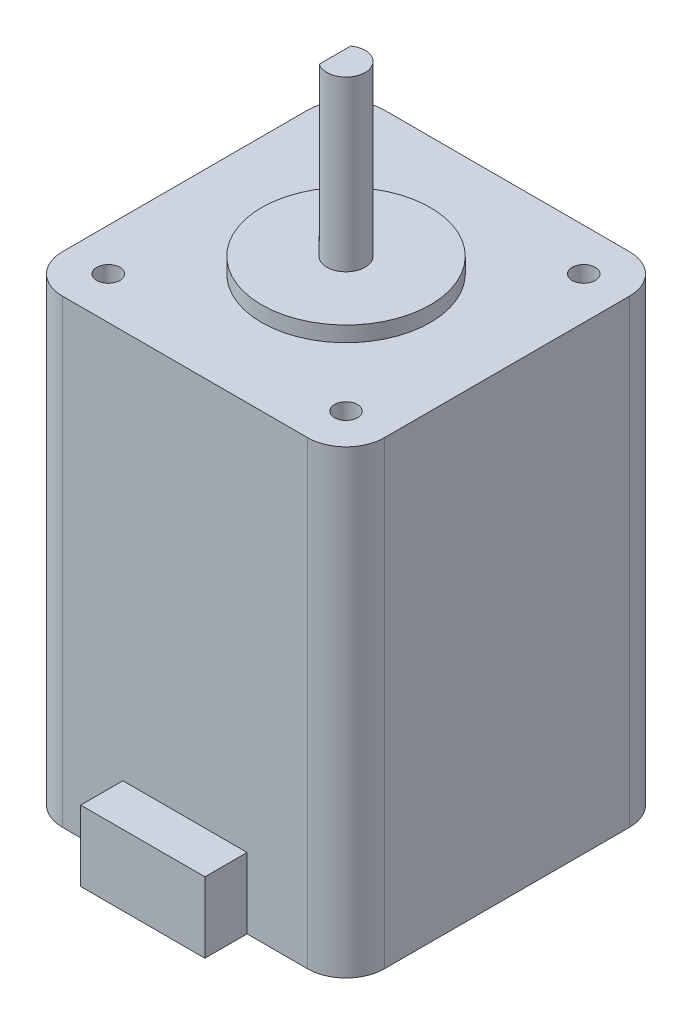
ISO-10303-21;
HEADER;
FILE_DESCRIPTION(('STEP AP214'),'2;1');
FILE_NAME('part.step','',(''),(''),'','','');
FILE_SCHEMA(('AUTOMOTIVE_DESIGN { 1 0 10303 214 1 1 1 1 }'));
ENDSEC;
DATA;
#1=APPLICATION_CONTEXT('core data for automotive mechanical design processes');
#2=APPLICATION_PROTOCOL_DEFINITION('international standard','automotive_design',2000,#1);
#3=PRODUCT_CONTEXT('',#1,'mechanical');
#4=PRODUCT('Part','Part','',(#3));
#5=PRODUCT_RELATED_PRODUCT_CATEGORY('part','',(#4));
#6=PRODUCT_DEFINITION_FORMATION('','',#4);
#7=PRODUCT_DEFINITION_CONTEXT('part definition',#1,'design');
#8=PRODUCT_DEFINITION('design','',#6,#7);
#9=PRODUCT_DEFINITION_SHAPE('','',#8);
#10=(LENGTH_UNIT() NAMED_UNIT(*) SI_UNIT(.MILLI.,.METRE.));
#11=(NAMED_UNIT(*) PLANE_ANGLE_UNIT() SI_UNIT($,.RADIAN.));
#12=(NAMED_UNIT(*) SI_UNIT($,.STERADIAN.) SOLID_ANGLE_UNIT());
#13=UNCERTAINTY_MEASURE_WITH_UNIT(LENGTH_MEASURE(1.E-05),#10,'distance_accuracy_value','');
#14=(GEOMETRIC_REPRESENTATION_CONTEXT(3) GLOBAL_UNCERTAINTY_ASSIGNED_CONTEXT((#13)) GLOBAL_UNIT_ASSIGNED_CONTEXT((#10,
#11,#12)) REPRESENTATION_CONTEXT('',''));
#15=CARTESIAN_POINT('',(0.,0.,0.));
#16=DIRECTION('',(0.,0.,1.));
#17=DIRECTION('',(1.,0.,0.));
#18=AXIS2_PLACEMENT_3D('',#15,#16,#17);
#19=CARTESIAN_POINT('',(0.,84.,0.));
#20=DIRECTION('',(0.,-1.,0.));
#21=DIRECTION('',(0.,0.,-1.));
#22=AXIS2_PLACEMENT_3D('',#19,#20,#21);
#23=CYLINDRICAL_SURFACE('',#22,2.5);
#24=CARTESIAN_POINT('',(0.,62.,0.));
#25=DIRECTION('',(0.,1.,0.));
#26=DIRECTION('',(0.,0.,1.));
#27=AXIS2_PLACEMENT_3D('',#24,#25,#26);
#28=CIRCLE('',#27,2.5);
#29=CARTESIAN_POINT('',(0.,62.,2.5));
#30=VERTEX_POINT('',#29);
#31=EDGE_CURVE('E250',#30,#30,#28,.T.);
#32=ORIENTED_EDGE('',*,*,#31,.T.);
#33=EDGE_LOOP('',(#32));
#34=FACE_BOUND('',#33,.T.);
#35=DIRECTION('',(0.,1.,0.));
#36=VECTOR('',#35,1.);
#37=CARTESIAN_POINT('',(-1.4382470003859,64.,-2.04485832415866));
#38=LINE('',#37,#36);
#39=CARTESIAN_POINT('',(-1.4382470003859,64.,-2.04485832415866));
#40=VERTEX_POINT('',#39);
#41=CARTESIAN_POINT('',(-1.4382470003859,84.,-2.04485832415866));
#42=VERTEX_POINT('',#41);
#43=EDGE_CURVE('E141',#40,#42,#38,.T.);
#44=ORIENTED_EDGE('',*,*,#43,.T.);
#45=CARTESIAN_POINT('',(0.,84.,0.));
#46=DIRECTION('',(0.,1.,0.));
#47=DIRECTION('',(0.,0.,1.));
#48=AXIS2_PLACEMENT_3D('',#45,#46,#47);
#49=CIRCLE('',#48,2.5);
#50=CARTESIAN_POINT('',(-1.4382470003859,84.,2.04485832415866));
#51=VERTEX_POINT('',#50);
#52=EDGE_CURVE('E246',#51,#42,#49,.T.);
#53=ORIENTED_EDGE('',*,*,#52,.F.);
#54=DIRECTION('',(0.,1.,0.));
#55=VECTOR('',#54,1.);
#56=CARTESIAN_POINT('',(-1.4382470003859,64.,2.04485832415866));
#57=LINE('',#56,#55);
#58=CARTESIAN_POINT('',(-1.4382470003859,64.,2.04485832415866));
#59=VERTEX_POINT('',#58);
#60=EDGE_CURVE('E57',#59,#51,#57,.T.);
#61=ORIENTED_EDGE('',*,*,#60,.F.);
#62=CARTESIAN_POINT('',(0.,64.,0.));
#63=DIRECTION('',(0.,1.,0.));
#64=DIRECTION('',(0.,0.,1.));
#65=AXIS2_PLACEMENT_3D('',#62,#63,#64);
#66=CIRCLE('',#65,2.5);
#67=EDGE_CURVE('E152',#40,#59,#66,.T.);
#68=ORIENTED_EDGE('',*,*,#67,.F.);
#69=EDGE_LOOP('',(#44,#53,#61,#68));
#70=FACE_BOUND('',#69,.T.);
#71=ADVANCED_FACE('F41',(#34,#70),#23,.T.);
#72=CARTESIAN_POINT('',(0.,84.,0.));
#73=DIRECTION('',(0.,1.,0.));
#74=DIRECTION('',(0.,0.,1.));
#75=AXIS2_PLACEMENT_3D('',#72,#73,#74);
#76=PLANE('',#75);
#77=ORIENTED_EDGE('',*,*,#52,.T.);
#78=DIRECTION('',(0.,0.,1.));
#79=VECTOR('',#78,1.);
#80=CARTESIAN_POINT('',(-1.4382470003859,84.,0.));
#81=LINE('',#80,#79);
#82=EDGE_CURVE('E146',#42,#51,#81,.T.);
#83=ORIENTED_EDGE('',*,*,#82,.T.);
#84=EDGE_LOOP('',(#77,#83));
#85=FACE_BOUND('',#84,.T.);
#86=ADVANCED_FACE('F399',(#85),#76,.T.);
#87=CARTESIAN_POINT('',(-21.,60.,21.));
#88=DIRECTION('',(0.,0.,-1.));
#89=DIRECTION('',(-1.,0.,0.));
#90=AXIS2_PLACEMENT_3D('',#87,#88,#89);
#91=PLANE('',#90);
#92=DIRECTION('',(1.,0.,0.));
#93=VECTOR('',#92,1.);
#94=CARTESIAN_POINT('',(-21.,0.,21.));
#95=LINE('',#94,#93);
#96=CARTESIAN_POINT('',(8.1,0.,21.));
#97=VERTEX_POINT('',#96);
#98=CARTESIAN_POINT('',(16.,0.,21.));
#99=VERTEX_POINT('',#98);
#100=EDGE_CURVE('E290',#97,#99,#95,.T.);
#101=ORIENTED_EDGE('',*,*,#100,.T.);
#102=DIRECTION('',(0.,-1.,0.));
#103=VECTOR('',#102,1.);
#104=CARTESIAN_POINT('',(16.,60.,21.));
#105=LINE('',#104,#103);
#106=CARTESIAN_POINT('',(16.,60.,21.));
#107=VERTEX_POINT('',#106);
#108=EDGE_CURVE('E11',#99,#107,#105,.F.);
#109=ORIENTED_EDGE('',*,*,#108,.T.);
#110=DIRECTION('',(1.,0.,0.));
#111=VECTOR('',#110,1.);
#112=CARTESIAN_POINT('',(-21.,60.,21.));
#113=LINE('',#112,#111);
#114=CARTESIAN_POINT('',(-16.,60.,21.));
#115=VERTEX_POINT('',#114);
#116=EDGE_CURVE('E263',#115,#107,#113,.T.);
#117=ORIENTED_EDGE('',*,*,#116,.F.);
#118=DIRECTION('',(0.,-1.,0.));
#119=VECTOR('',#118,1.);
#120=CARTESIAN_POINT('',(-16.,60.,21.));
#121=LINE('',#120,#119);
#122=CARTESIAN_POINT('',(-16.,0.,21.));
#123=VERTEX_POINT('',#122);
#124=EDGE_CURVE('E50',#115,#123,#121,.T.);
#125=ORIENTED_EDGE('',*,*,#124,.T.);
#126=CARTESIAN_POINT('',(-8.1,0.,21.));
#127=VERTEX_POINT('',#126);
#128=EDGE_CURVE('E269',#123,#127,#95,.T.);
#129=ORIENTED_EDGE('',*,*,#128,.T.);
#130=DIRECTION('',(0.,-1.,0.));
#131=VECTOR('',#130,1.);
#132=CARTESIAN_POINT('',(-8.1,9.2,21.));
#133=LINE('',#132,#131);
#134=CARTESIAN_POINT('',(-8.1,9.2,21.));
#135=VERTEX_POINT('',#134);
#136=EDGE_CURVE('E211',#135,#127,#133,.T.);
#137=ORIENTED_EDGE('',*,*,#136,.F.);
#138=DIRECTION('',(-1.,0.,0.));
#139=VECTOR('',#138,1.);
#140=CARTESIAN_POINT('',(-8.1,9.2,21.));
#141=LINE('',#140,#139);
#142=CARTESIAN_POINT('',(8.1,9.2,21.));
#143=VERTEX_POINT('',#142);
#144=EDGE_CURVE('E224',#143,#135,#141,.T.);
#145=ORIENTED_EDGE('',*,*,#144,.F.);
#146=DIRECTION('',(0.,1.,0.));
#147=VECTOR('',#146,1.);
#148=CARTESIAN_POINT('',(8.1,9.2,21.));
#149=LINE('',#148,#147);
#150=EDGE_CURVE('E202',#97,#143,#149,.T.);
#151=ORIENTED_EDGE('',*,*,#150,.F.);
#152=EDGE_LOOP('',(#101,#109,#117,#125,#129,#137,#145,#151));
#153=FACE_BOUND('',#152,.T.);
#154=ADVANCED_FACE('F340',(#153),#91,.F.);
#155=CARTESIAN_POINT('',(21.,60.,-21.));
#156=DIRECTION('',(-1.,0.,0.));
#157=DIRECTION('',(0.,0.,1.));
#158=AXIS2_PLACEMENT_3D('',#155,#156,#157);
#159=PLANE('',#158);
#160=DIRECTION('',(0.,0.,-1.));
#161=VECTOR('',#160,1.);
#162=CARTESIAN_POINT('',(21.,0.,-21.));
#163=LINE('',#162,#161);
#164=CARTESIAN_POINT('',(21.,0.,16.));
#165=VERTEX_POINT('',#164);
#166=CARTESIAN_POINT('',(21.,0.,-16.));
#167=VERTEX_POINT('',#166);
#168=EDGE_CURVE('E259',#165,#167,#163,.T.);
#169=ORIENTED_EDGE('',*,*,#168,.T.);
#170=DIRECTION('',(0.,-1.,0.));
#171=VECTOR('',#170,1.);
#172=CARTESIAN_POINT('',(21.,60.,-16.));
#173=LINE('',#172,#171);
#174=CARTESIAN_POINT('',(21.,60.,-16.));
#175=VERTEX_POINT('',#174);
#176=EDGE_CURVE('E315',#167,#175,#173,.F.);
#177=ORIENTED_EDGE('',*,*,#176,.T.);
#178=DIRECTION('',(0.,0.,-1.));
#179=VECTOR('',#178,1.);
#180=CARTESIAN_POINT('',(21.,60.,-21.));
#181=LINE('',#180,#179);
#182=CARTESIAN_POINT('',(21.,60.,16.));
#183=VERTEX_POINT('',#182);
#184=EDGE_CURVE('E264',#183,#175,#181,.T.);
#185=ORIENTED_EDGE('',*,*,#184,.F.);
#186=DIRECTION('',(0.,-1.,0.));
#187=VECTOR('',#186,1.);
#188=CARTESIAN_POINT('',(21.,60.,16.));
#189=LINE('',#188,#187);
#190=EDGE_CURVE('E311',#183,#165,#189,.T.);
#191=ORIENTED_EDGE('',*,*,#190,.T.);
#192=EDGE_LOOP('',(#169,#177,#185,#191));
#193=FACE_BOUND('',#192,.T.);
#194=ADVANCED_FACE('F369',(#193),#159,.F.);
#195=CARTESIAN_POINT('',(-21.,60.,-21.));
#196=DIRECTION('',(0.,0.,1.));
#197=DIRECTION('',(1.,0.,0.));
#198=AXIS2_PLACEMENT_3D('',#195,#196,#197);
#199=PLANE('',#198);
#200=DIRECTION('',(-1.,0.,0.));
#201=VECTOR('',#200,1.);
#202=CARTESIAN_POINT('',(-21.,60.,-21.));
#203=LINE('',#202,#201);
#204=CARTESIAN_POINT('',(16.,60.,-21.));
#205=VERTEX_POINT('',#204);
#206=CARTESIAN_POINT('',(-16.,60.,-21.));
#207=VERTEX_POINT('',#206);
#208=EDGE_CURVE('E268',#205,#207,#203,.T.);
#209=ORIENTED_EDGE('',*,*,#208,.F.);
#210=DIRECTION('',(0.,-1.,0.));
#211=VECTOR('',#210,1.);
#212=CARTESIAN_POINT('',(16.,60.,-21.));
#213=LINE('',#212,#211);
#214=CARTESIAN_POINT('',(16.,0.,-21.));
#215=VERTEX_POINT('',#214);
#216=EDGE_CURVE('E295',#205,#215,#213,.T.);
#217=ORIENTED_EDGE('',*,*,#216,.T.);
#218=DIRECTION('',(-1.,0.,0.));
#219=VECTOR('',#218,1.);
#220=CARTESIAN_POINT('',(-21.,0.,-21.));
#221=LINE('',#220,#219);
#222=CARTESIAN_POINT('',(-16.,0.,-21.));
#223=VERTEX_POINT('',#222);
#224=EDGE_CURVE('E282',#215,#223,#221,.T.);
#225=ORIENTED_EDGE('',*,*,#224,.T.);
#226=DIRECTION('',(0.,-1.,0.));
#227=VECTOR('',#226,1.);
#228=CARTESIAN_POINT('',(-16.,60.,-21.));
#229=LINE('',#228,#227);
#230=EDGE_CURVE('E254',#223,#207,#229,.F.);
#231=ORIENTED_EDGE('',*,*,#230,.T.);
#232=EDGE_LOOP('',(#209,#217,#225,#231));
#233=FACE_BOUND('',#232,.T.);
#234=ADVANCED_FACE('F379',(#233),#199,.F.);
#235=CARTESIAN_POINT('',(-21.,60.,-21.));
#236=DIRECTION('',(1.,0.,0.));
#237=DIRECTION('',(0.,0.,-1.));
#238=AXIS2_PLACEMENT_3D('',#235,#236,#237);
#239=PLANE('',#238);
#240=DIRECTION('',(0.,0.,1.));
#241=VECTOR('',#240,1.);
#242=CARTESIAN_POINT('',(-21.,60.,-21.));
#243=LINE('',#242,#241);
#244=CARTESIAN_POINT('',(-21.,60.,-16.));
#245=VERTEX_POINT('',#244);
#246=CARTESIAN_POINT('',(-21.,60.,16.));
#247=VERTEX_POINT('',#246);
#248=EDGE_CURVE('E273',#245,#247,#243,.T.);
#249=ORIENTED_EDGE('',*,*,#248,.F.);
#250=DIRECTION('',(0.,-1.,0.));
#251=VECTOR('',#250,1.);
#252=CARTESIAN_POINT('',(-21.,60.,-16.));
#253=LINE('',#252,#251);
#254=CARTESIAN_POINT('',(-21.,0.,-16.));
#255=VERTEX_POINT('',#254);
#256=EDGE_CURVE('E333',#245,#255,#253,.T.);
#257=ORIENTED_EDGE('',*,*,#256,.T.);
#258=DIRECTION('',(0.,0.,1.));
#259=VECTOR('',#258,1.);
#260=CARTESIAN_POINT('',(-21.,0.,-21.));
#261=LINE('',#260,#259);
#262=CARTESIAN_POINT('',(-21.,0.,16.));
#263=VERTEX_POINT('',#262);
#264=EDGE_CURVE('E286',#255,#263,#261,.T.);
#265=ORIENTED_EDGE('',*,*,#264,.T.);
#266=DIRECTION('',(0.,-1.,0.));
#267=VECTOR('',#266,1.);
#268=CARTESIAN_POINT('',(-21.,60.,16.));
#269=LINE('',#268,#267);
#270=EDGE_CURVE('E330',#263,#247,#269,.F.);
#271=ORIENTED_EDGE('',*,*,#270,.T.);
#272=EDGE_LOOP('',(#249,#257,#265,#271));
#273=FACE_BOUND('',#272,.T.);
#274=ADVANCED_FACE('F387',(#273),#239,.F.);
#275=CARTESIAN_POINT('',(0.,60.,0.));
#276=DIRECTION('',(0.,1.,0.));
#277=DIRECTION('',(0.,0.,1.));
#278=AXIS2_PLACEMENT_3D('',#275,#276,#277);
#279=PLANE('',#278);
#280=CARTESIAN_POINT('',(-15.4999999999991,60.,15.5));
#281=DIRECTION('',(0.,1.,0.));
#282=DIRECTION('',(0.,0.,1.));
#283=AXIS2_PLACEMENT_3D('',#280,#281,#282);
#284=CIRCLE('',#283,1.50000000000046);
#285=CARTESIAN_POINT('',(-15.4999999999991,60.,17.0000000000005));
#286=VERTEX_POINT('',#285);
#287=EDGE_CURVE('E170',#286,#286,#284,.T.);
#288=ORIENTED_EDGE('',*,*,#287,.F.);
#289=EDGE_LOOP('',(#288));
#290=FACE_BOUND('',#289,.T.);
#291=CARTESIAN_POINT('',(15.5000000000009,60.,15.4999999999991));
#292=DIRECTION('',(0.,1.,0.));
#293=DIRECTION('',(0.,0.,1.));
#294=AXIS2_PLACEMENT_3D('',#291,#292,#293);
#295=CIRCLE('',#294,1.50000000000121);
#296=CARTESIAN_POINT('',(15.5000000000009,60.,17.0000000000003));
#297=VERTEX_POINT('',#296);
#298=EDGE_CURVE('E187',#297,#297,#295,.T.);
#299=ORIENTED_EDGE('',*,*,#298,.F.);
#300=EDGE_LOOP('',(#299));
#301=FACE_BOUND('',#300,.T.);
#302=CARTESIAN_POINT('',(15.5,60.,-15.5000000000009));
#303=DIRECTION('',(0.,1.,0.));
#304=DIRECTION('',(0.,0.,1.));
#305=AXIS2_PLACEMENT_3D('',#302,#303,#304);
#306=CIRCLE('',#305,1.5000000000009);
#307=CARTESIAN_POINT('',(15.5,60.,-14.));
#308=VERTEX_POINT('',#307);
#309=EDGE_CURVE('E179',#308,#308,#306,.T.);
#310=ORIENTED_EDGE('',*,*,#309,.F.);
#311=EDGE_LOOP('',(#310));
#312=FACE_BOUND('',#311,.T.);
#313=CARTESIAN_POINT('',(-15.5,60.,-15.5));
#314=DIRECTION('',(0.,1.,0.));
#315=DIRECTION('',(0.,0.,1.));
#316=AXIS2_PLACEMENT_3D('',#313,#314,#315);
#317=CIRCLE('',#316,1.5);
#318=CARTESIAN_POINT('',(-15.5,60.,-14.));
#319=VERTEX_POINT('',#318);
#320=EDGE_CURVE('E178',#319,#319,#317,.T.);
#321=ORIENTED_EDGE('',*,*,#320,.F.);
#322=EDGE_LOOP('',(#321));
#323=FACE_BOUND('',#322,.T.);
#324=CARTESIAN_POINT('',(0.,60.,0.));
#325=DIRECTION('',(0.,1.,0.));
#326=DIRECTION('',(0.,0.,1.));
#327=AXIS2_PLACEMENT_3D('',#324,#325,#326);
#328=CIRCLE('',#327,11.);
#329=CARTESIAN_POINT('',(0.,60.,11.));
#330=VERTEX_POINT('',#329);
#331=EDGE_CURVE('E255',#330,#330,#328,.T.);
#332=ORIENTED_EDGE('',*,*,#331,.F.);
#333=EDGE_LOOP('',(#332));
#334=FACE_BOUND('',#333,.T.);
#335=ORIENTED_EDGE('',*,*,#184,.T.);
#336=CARTESIAN_POINT('',(16.,60.,-16.));
#337=DIRECTION('',(0.,1.,0.));
#338=DIRECTION('',(0.,0.,1.));
#339=AXIS2_PLACEMENT_3D('',#336,#337,#338);
#340=CIRCLE('',#339,5.);
#341=EDGE_CURVE('E327',#175,#205,#340,.T.);
#342=ORIENTED_EDGE('',*,*,#341,.T.);
#343=ORIENTED_EDGE('',*,*,#208,.T.);
#344=CARTESIAN_POINT('',(-16.,60.,-16.));
#345=DIRECTION('',(0.,1.,0.));
#346=DIRECTION('',(0.,0.,1.));
#347=AXIS2_PLACEMENT_3D('',#344,#345,#346);
#348=CIRCLE('',#347,5.);
#349=EDGE_CURVE('E324',#207,#245,#348,.T.);
#350=ORIENTED_EDGE('',*,*,#349,.T.);
#351=ORIENTED_EDGE('',*,*,#248,.T.);
#352=CARTESIAN_POINT('',(-16.,60.,16.));
#353=DIRECTION('',(0.,1.,0.));
#354=DIRECTION('',(0.,0.,1.));
#355=AXIS2_PLACEMENT_3D('',#352,#353,#354);
#356=CIRCLE('',#355,5.);
#357=EDGE_CURVE('E318',#247,#115,#356,.T.);
#358=ORIENTED_EDGE('',*,*,#357,.T.);
#359=ORIENTED_EDGE('',*,*,#116,.T.);
#360=CARTESIAN_POINT('',(16.,60.,16.));
#361=DIRECTION('',(0.,1.,0.));
#362=DIRECTION('',(0.,0.,1.));
#363=AXIS2_PLACEMENT_3D('',#360,#361,#362);
#364=CIRCLE('',#363,5.);
#365=EDGE_CURVE('E321',#107,#183,#364,.T.);
#366=ORIENTED_EDGE('',*,*,#365,.T.);
#367=EDGE_LOOP('',(#335,#342,#343,#350,#351,#358,#359,#366));
#368=FACE_BOUND('',#367,.T.);
#369=ADVANCED_FACE('F373',(#290,#301,#312,#323,#334,#368),#279,.T.);
#370=CARTESIAN_POINT('',(0.,0.,0.));
#371=DIRECTION('',(0.,1.,0.));
#372=DIRECTION('',(0.,0.,1.));
#373=AXIS2_PLACEMENT_3D('',#370,#371,#372);
#374=PLANE('',#373);
#375=CARTESIAN_POINT('',(0.,0.,0.));
#376=DIRECTION('',(0.,-1.,0.));
#377=DIRECTION('',(0.,0.,-1.));
#378=AXIS2_PLACEMENT_3D('',#375,#376,#377);
#379=CIRCLE('',#378,4.);
#380=CARTESIAN_POINT('',(0.,0.,-4.));
#381=VERTEX_POINT('',#380);
#382=EDGE_CURVE('E164',#381,#381,#379,.T.);
#383=ORIENTED_EDGE('',*,*,#382,.F.);
#384=EDGE_LOOP('',(#383));
#385=FACE_BOUND('',#384,.T.);
#386=ORIENTED_EDGE('',*,*,#224,.F.);
#387=CARTESIAN_POINT('',(16.,0.,-16.));
#388=DIRECTION('',(0.,1.,0.));
#389=DIRECTION('',(0.,0.,1.));
#390=AXIS2_PLACEMENT_3D('',#387,#388,#389);
#391=CIRCLE('',#390,5.);
#392=EDGE_CURVE('E308',#215,#167,#391,.F.);
#393=ORIENTED_EDGE('',*,*,#392,.T.);
#394=ORIENTED_EDGE('',*,*,#168,.F.);
#395=CARTESIAN_POINT('',(16.,0.,16.));
#396=DIRECTION('',(0.,1.,0.));
#397=DIRECTION('',(0.,0.,1.));
#398=AXIS2_PLACEMENT_3D('',#395,#396,#397);
#399=CIRCLE('',#398,5.);
#400=EDGE_CURVE('E302',#165,#99,#399,.F.);
#401=ORIENTED_EDGE('',*,*,#400,.T.);
#402=ORIENTED_EDGE('',*,*,#100,.F.);
#403=DIRECTION('',(0.,0.,-1.));
#404=VECTOR('',#403,1.);
#405=CARTESIAN_POINT('',(8.1,0.,26.5));
#406=LINE('',#405,#404);
#407=CARTESIAN_POINT('',(8.1,0.,26.5));
#408=VERTEX_POINT('',#407);
#409=EDGE_CURVE('E220',#408,#97,#406,.T.);
#410=ORIENTED_EDGE('',*,*,#409,.F.);
#411=DIRECTION('',(1.,0.,0.));
#412=VECTOR('',#411,1.);
#413=CARTESIAN_POINT('',(-8.1,0.,26.5));
#414=LINE('',#413,#412);
#415=CARTESIAN_POINT('',(-8.1,0.,26.5));
#416=VERTEX_POINT('',#415);
#417=EDGE_CURVE('E217',#416,#408,#414,.T.);
#418=ORIENTED_EDGE('',*,*,#417,.F.);
#419=DIRECTION('',(0.,0.,-1.));
#420=VECTOR('',#419,1.);
#421=CARTESIAN_POINT('',(-8.1,0.,26.5));
#422=LINE('',#421,#420);
#423=EDGE_CURVE('E234',#416,#127,#422,.T.);
#424=ORIENTED_EDGE('',*,*,#423,.T.);
#425=ORIENTED_EDGE('',*,*,#128,.F.);
#426=CARTESIAN_POINT('',(-16.,0.,16.));
#427=DIRECTION('',(0.,1.,0.));
#428=DIRECTION('',(0.,0.,1.));
#429=AXIS2_PLACEMENT_3D('',#426,#427,#428);
#430=CIRCLE('',#429,5.);
#431=EDGE_CURVE('E299',#123,#263,#430,.F.);
#432=ORIENTED_EDGE('',*,*,#431,.T.);
#433=ORIENTED_EDGE('',*,*,#264,.F.);
#434=CARTESIAN_POINT('',(-16.,0.,-16.));
#435=DIRECTION('',(0.,1.,0.));
#436=DIRECTION('',(0.,0.,1.));
#437=AXIS2_PLACEMENT_3D('',#434,#435,#436);
#438=CIRCLE('',#437,5.);
#439=EDGE_CURVE('E305',#255,#223,#438,.F.);
#440=ORIENTED_EDGE('',*,*,#439,.T.);
#441=EDGE_LOOP('',(#386,#393,#394,#401,#402,#410,#418,#424,#425,#432,#433,#440));
#442=FACE_BOUND('',#441,.T.);
#443=ADVANCED_FACE('F345',(#385,#442),#374,.F.);
#444=CARTESIAN_POINT('',(0.,62.,0.));
#445=DIRECTION('',(0.,-1.,0.));
#446=DIRECTION('',(0.,0.,-1.));
#447=AXIS2_PLACEMENT_3D('',#444,#445,#446);
#448=CYLINDRICAL_SURFACE('',#447,11.);
#449=CARTESIAN_POINT('',(0.,62.,0.));
#450=DIRECTION('',(0.,1.,0.));
#451=DIRECTION('',(0.,0.,1.));
#452=AXIS2_PLACEMENT_3D('',#449,#450,#451);
#453=CIRCLE('',#452,11.);
#454=CARTESIAN_POINT('',(0.,62.,11.));
#455=VERTEX_POINT('',#454);
#456=EDGE_CURVE('E249',#455,#455,#453,.T.);
#457=ORIENTED_EDGE('',*,*,#456,.F.);
#458=EDGE_LOOP('',(#457));
#459=FACE_BOUND('',#458,.T.);
#460=ORIENTED_EDGE('',*,*,#331,.T.);
#461=EDGE_LOOP('',(#460));
#462=FACE_BOUND('',#461,.T.);
#463=ADVANCED_FACE('F412',(#459,#462),#448,.T.);
#464=CARTESIAN_POINT('',(0.,62.,0.));
#465=DIRECTION('',(0.,1.,0.));
#466=DIRECTION('',(0.,0.,1.));
#467=AXIS2_PLACEMENT_3D('',#464,#465,#466);
#468=PLANE('',#467);
#469=ORIENTED_EDGE('',*,*,#31,.F.);
#470=EDGE_LOOP('',(#469));
#471=FACE_BOUND('',#470,.T.);
#472=ORIENTED_EDGE('',*,*,#456,.T.);
#473=EDGE_LOOP('',(#472));
#474=FACE_BOUND('',#473,.T.);
#475=ADVANCED_FACE('F409',(#471,#474),#468,.T.);
#476=CARTESIAN_POINT('',(8.1,9.2,26.5));
#477=DIRECTION('',(-1.,0.,0.));
#478=DIRECTION('',(0.,0.,1.));
#479=AXIS2_PLACEMENT_3D('',#476,#477,#478);
#480=PLANE('',#479);
#481=ORIENTED_EDGE('',*,*,#150,.T.);
#482=DIRECTION('',(0.,0.,-1.));
#483=VECTOR('',#482,1.);
#484=CARTESIAN_POINT('',(8.1,9.2,26.5));
#485=LINE('',#484,#483);
#486=CARTESIAN_POINT('',(8.1,9.2,26.5));
#487=VERTEX_POINT('',#486);
#488=EDGE_CURVE('E242',#487,#143,#485,.T.);
#489=ORIENTED_EDGE('',*,*,#488,.F.);
#490=DIRECTION('',(0.,1.,0.));
#491=VECTOR('',#490,1.);
#492=CARTESIAN_POINT('',(8.1,9.2,26.5));
#493=LINE('',#492,#491);
#494=EDGE_CURVE('E206',#408,#487,#493,.T.);
#495=ORIENTED_EDGE('',*,*,#494,.F.);
#496=ORIENTED_EDGE('',*,*,#409,.T.);
#497=EDGE_LOOP('',(#481,#489,#495,#496));
#498=FACE_BOUND('',#497,.T.);
#499=ADVANCED_FACE('F359',(#498),#480,.F.);
#500=CARTESIAN_POINT('',(-8.1,9.2,26.5));
#501=DIRECTION('',(0.,-1.,0.));
#502=DIRECTION('',(0.,0.,-1.));
#503=AXIS2_PLACEMENT_3D('',#500,#501,#502);
#504=PLANE('',#503);
#505=ORIENTED_EDGE('',*,*,#144,.T.);
#506=DIRECTION('',(0.,0.,-1.));
#507=VECTOR('',#506,1.);
#508=CARTESIAN_POINT('',(-8.1,9.2,26.5));
#509=LINE('',#508,#507);
#510=CARTESIAN_POINT('',(-8.1,9.2,26.5));
#511=VERTEX_POINT('',#510);
#512=EDGE_CURVE('E238',#511,#135,#509,.T.);
#513=ORIENTED_EDGE('',*,*,#512,.F.);
#514=DIRECTION('',(-1.,0.,0.));
#515=VECTOR('',#514,1.);
#516=CARTESIAN_POINT('',(-8.1,9.2,26.5));
#517=LINE('',#516,#515);
#518=EDGE_CURVE('E210',#487,#511,#517,.T.);
#519=ORIENTED_EDGE('',*,*,#518,.F.);
#520=ORIENTED_EDGE('',*,*,#488,.T.);
#521=EDGE_LOOP('',(#505,#513,#519,#520));
#522=FACE_BOUND('',#521,.T.);
#523=ADVANCED_FACE('F355',(#522),#504,.F.);
#524=CARTESIAN_POINT('',(-8.1,9.2,26.5));
#525=DIRECTION('',(1.,0.,0.));
#526=DIRECTION('',(0.,1.,0.));
#527=AXIS2_PLACEMENT_3D('',#524,#525,#526);
#528=PLANE('',#527);
#529=ORIENTED_EDGE('',*,*,#136,.T.);
#530=ORIENTED_EDGE('',*,*,#423,.F.);
#531=DIRECTION('',(0.,-1.,0.));
#532=VECTOR('',#531,1.);
#533=CARTESIAN_POINT('',(-8.1,9.2,26.5));
#534=LINE('',#533,#532);
#535=EDGE_CURVE('E214',#511,#416,#534,.T.);
#536=ORIENTED_EDGE('',*,*,#535,.F.);
#537=ORIENTED_EDGE('',*,*,#512,.T.);
#538=EDGE_LOOP('',(#529,#530,#536,#537));
#539=FACE_BOUND('',#538,.T.);
#540=ADVANCED_FACE('F352',(#539),#528,.F.);
#541=CARTESIAN_POINT('',(0.,0.,26.5));
#542=DIRECTION('',(0.,0.,1.));
#543=DIRECTION('',(1.,0.,0.));
#544=AXIS2_PLACEMENT_3D('',#541,#542,#543);
#545=PLANE('',#544);
#546=ORIENTED_EDGE('',*,*,#494,.T.);
#547=ORIENTED_EDGE('',*,*,#518,.T.);
#548=ORIENTED_EDGE('',*,*,#535,.T.);
#549=ORIENTED_EDGE('',*,*,#417,.T.);
#550=EDGE_LOOP('',(#546,#547,#548,#549));
#551=FACE_BOUND('',#550,.T.);
#552=ADVANCED_FACE('F482',(#551),#545,.T.);
#553=CARTESIAN_POINT('',(-15.5,55.,-15.5));
#554=DIRECTION('',(0.,1.,0.));
#555=DIRECTION('',(0.,0.,1.));
#556=AXIS2_PLACEMENT_3D('',#553,#554,#555);
#557=CYLINDRICAL_SURFACE('',#556,1.5);
#558=CARTESIAN_POINT('',(-15.5,55.,-15.5));
#559=DIRECTION('',(0.,1.,0.));
#560=DIRECTION('',(0.,0.,1.));
#561=AXIS2_PLACEMENT_3D('',#558,#559,#560);
#562=CIRCLE('',#561,1.5);
#563=CARTESIAN_POINT('',(-15.5,55.,-14.));
#564=VERTEX_POINT('',#563);
#565=EDGE_CURVE('E198',#564,#564,#562,.T.);
#566=ORIENTED_EDGE('',*,*,#565,.F.);
#567=EDGE_LOOP('',(#566));
#568=FACE_BOUND('',#567,.T.);
#569=ORIENTED_EDGE('',*,*,#320,.T.);
#570=EDGE_LOOP('',(#569));
#571=FACE_BOUND('',#570,.T.);
#572=ADVANCED_FACE('F489',(#568,#571),#557,.F.);
#573=CARTESIAN_POINT('',(-15.5,55.,-15.5));
#574=DIRECTION('',(0.,1.,0.));
#575=DIRECTION('',(0.,0.,1.));
#576=AXIS2_PLACEMENT_3D('',#573,#574,#575);
#577=PLANE('',#576);
#578=ORIENTED_EDGE('',*,*,#565,.T.);
#579=EDGE_LOOP('',(#578));
#580=FACE_BOUND('',#579,.T.);
#581=ADVANCED_FACE('F497',(#580),#577,.T.);
#582=CARTESIAN_POINT('',(15.5,55.,-15.5000000000009));
#583=DIRECTION('',(0.,1.,0.));
#584=DIRECTION('',(0.,0.,1.));
#585=AXIS2_PLACEMENT_3D('',#582,#583,#584);
#586=CYLINDRICAL_SURFACE('',#585,1.5000000000009);
#587=CARTESIAN_POINT('',(15.5,55.,-15.5000000000009));
#588=DIRECTION('',(0.,1.,0.));
#589=DIRECTION('',(0.,0.,1.));
#590=AXIS2_PLACEMENT_3D('',#587,#588,#589);
#591=CIRCLE('',#590,1.5000000000009);
#592=CARTESIAN_POINT('',(15.5,55.,-14.));
#593=VERTEX_POINT('',#592);
#594=EDGE_CURVE('E174',#593,#593,#591,.T.);
#595=ORIENTED_EDGE('',*,*,#594,.F.);
#596=EDGE_LOOP('',(#595));
#597=FACE_BOUND('',#596,.T.);
#598=ORIENTED_EDGE('',*,*,#309,.T.);
#599=EDGE_LOOP('',(#598));
#600=FACE_BOUND('',#599,.T.);
#601=ADVANCED_FACE('F505',(#597,#600),#586,.F.);
#602=CARTESIAN_POINT('',(15.5,55.,-15.5000000000009));
#603=DIRECTION('',(0.,1.,0.));
#604=DIRECTION('',(0.,0.,1.));
#605=AXIS2_PLACEMENT_3D('',#602,#603,#604);
#606=PLANE('',#605);
#607=ORIENTED_EDGE('',*,*,#594,.T.);
#608=EDGE_LOOP('',(#607));
#609=FACE_BOUND('',#608,.T.);
#610=ADVANCED_FACE('F513',(#609),#606,.T.);
#611=CARTESIAN_POINT('',(15.5000000000009,55.,15.4999999999991));
#612=DIRECTION('',(0.,1.,0.));
#613=DIRECTION('',(0.,0.,1.));
#614=AXIS2_PLACEMENT_3D('',#611,#612,#613);
#615=CYLINDRICAL_SURFACE('',#614,1.50000000000121);
#616=CARTESIAN_POINT('',(15.5000000000009,55.,15.4999999999991));
#617=DIRECTION('',(0.,1.,0.));
#618=DIRECTION('',(0.,0.,1.));
#619=AXIS2_PLACEMENT_3D('',#616,#617,#618);
#620=CIRCLE('',#619,1.50000000000121);
#621=CARTESIAN_POINT('',(15.5000000000009,55.,17.0000000000003));
#622=VERTEX_POINT('',#621);
#623=EDGE_CURVE('E183',#622,#622,#620,.T.);
#624=ORIENTED_EDGE('',*,*,#623,.F.);
#625=EDGE_LOOP('',(#624));
#626=FACE_BOUND('',#625,.T.);
#627=ORIENTED_EDGE('',*,*,#298,.T.);
#628=EDGE_LOOP('',(#627));
#629=FACE_BOUND('',#628,.T.);
#630=ADVANCED_FACE('F521',(#626,#629),#615,.F.);
#631=CARTESIAN_POINT('',(15.5000000000009,55.,15.4999999999991));
#632=DIRECTION('',(0.,1.,0.));
#633=DIRECTION('',(0.,0.,1.));
#634=AXIS2_PLACEMENT_3D('',#631,#632,#633);
#635=PLANE('',#634);
#636=ORIENTED_EDGE('',*,*,#623,.T.);
#637=EDGE_LOOP('',(#636));
#638=FACE_BOUND('',#637,.T.);
#639=ADVANCED_FACE('F529',(#638),#635,.T.);
#640=CARTESIAN_POINT('',(-15.4999999999991,55.,15.5));
#641=DIRECTION('',(0.,1.,0.));
#642=DIRECTION('',(0.,0.,1.));
#643=AXIS2_PLACEMENT_3D('',#640,#641,#642);
#644=CYLINDRICAL_SURFACE('',#643,1.50000000000046);
#645=CARTESIAN_POINT('',(-15.4999999999991,55.,15.5));
#646=DIRECTION('',(0.,1.,0.));
#647=DIRECTION('',(0.,0.,1.));
#648=AXIS2_PLACEMENT_3D('',#645,#646,#647);
#649=CIRCLE('',#648,1.50000000000046);
#650=CARTESIAN_POINT('',(-15.4999999999991,55.,17.0000000000005));
#651=VERTEX_POINT('',#650);
#652=EDGE_CURVE('E191',#651,#651,#649,.T.);
#653=ORIENTED_EDGE('',*,*,#652,.F.);
#654=EDGE_LOOP('',(#653));
#655=FACE_BOUND('',#654,.T.);
#656=ORIENTED_EDGE('',*,*,#287,.T.);
#657=EDGE_LOOP('',(#656));
#658=FACE_BOUND('',#657,.T.);
#659=ADVANCED_FACE('F537',(#655,#658),#644,.F.);
#660=CARTESIAN_POINT('',(-15.4999999999991,55.,15.5));
#661=DIRECTION('',(0.,1.,0.));
#662=DIRECTION('',(0.,0.,1.));
#663=AXIS2_PLACEMENT_3D('',#660,#661,#662);
#664=PLANE('',#663);
#665=ORIENTED_EDGE('',*,*,#652,.T.);
#666=EDGE_LOOP('',(#665));
#667=FACE_BOUND('',#666,.T.);
#668=ADVANCED_FACE('F433',(#667),#664,.T.);
#669=CARTESIAN_POINT('',(16.,60.,-16.));
#670=DIRECTION('',(0.,-1.,0.));
#671=DIRECTION('',(0.,0.,-1.));
#672=AXIS2_PLACEMENT_3D('',#669,#670,#671);
#673=CYLINDRICAL_SURFACE('',#672,5.);
#674=ORIENTED_EDGE('',*,*,#341,.F.);
#675=ORIENTED_EDGE('',*,*,#176,.F.);
#676=ORIENTED_EDGE('',*,*,#392,.F.);
#677=ORIENTED_EDGE('',*,*,#216,.F.);
#678=EDGE_LOOP('',(#674,#675,#676,#677));
#679=FACE_BOUND('',#678,.T.);
#680=ADVANCED_FACE('F377',(#679),#673,.T.);
#681=CARTESIAN_POINT('',(-16.,60.,-16.));
#682=DIRECTION('',(0.,-1.,0.));
#683=DIRECTION('',(0.,0.,-1.));
#684=AXIS2_PLACEMENT_3D('',#681,#682,#683);
#685=CYLINDRICAL_SURFACE('',#684,5.);
#686=ORIENTED_EDGE('',*,*,#349,.F.);
#687=ORIENTED_EDGE('',*,*,#230,.F.);
#688=ORIENTED_EDGE('',*,*,#439,.F.);
#689=ORIENTED_EDGE('',*,*,#256,.F.);
#690=EDGE_LOOP('',(#686,#687,#688,#689));
#691=FACE_BOUND('',#690,.T.);
#692=ADVANCED_FACE('F384',(#691),#685,.T.);
#693=CARTESIAN_POINT('',(16.,60.,16.));
#694=DIRECTION('',(0.,-1.,0.));
#695=DIRECTION('',(0.,0.,-1.));
#696=AXIS2_PLACEMENT_3D('',#693,#694,#695);
#697=CYLINDRICAL_SURFACE('',#696,5.);
#698=ORIENTED_EDGE('',*,*,#365,.F.);
#699=ORIENTED_EDGE('',*,*,#108,.F.);
#700=ORIENTED_EDGE('',*,*,#400,.F.);
#701=ORIENTED_EDGE('',*,*,#190,.F.);
#702=EDGE_LOOP('',(#698,#699,#700,#701));
#703=FACE_BOUND('',#702,.T.);
#704=ADVANCED_FACE('F366',(#703),#697,.T.);
#705=CARTESIAN_POINT('',(-16.,60.,16.));
#706=DIRECTION('',(0.,-1.,0.));
#707=DIRECTION('',(0.,0.,-1.));
#708=AXIS2_PLACEMENT_3D('',#705,#706,#707);
#709=CYLINDRICAL_SURFACE('',#708,5.);
#710=ORIENTED_EDGE('',*,*,#357,.F.);
#711=ORIENTED_EDGE('',*,*,#270,.F.);
#712=ORIENTED_EDGE('',*,*,#431,.F.);
#713=ORIENTED_EDGE('',*,*,#124,.F.);
#714=EDGE_LOOP('',(#710,#711,#712,#713));
#715=FACE_BOUND('',#714,.T.);
#716=ADVANCED_FACE('F43',(#715),#709,.T.);
#717=CARTESIAN_POINT('',(0.,5.,0.));
#718=DIRECTION('',(0.,-1.,0.));
#719=DIRECTION('',(0.,0.,-1.));
#720=AXIS2_PLACEMENT_3D('',#717,#718,#719);
#721=CYLINDRICAL_SURFACE('',#720,4.);
#722=CARTESIAN_POINT('',(0.,5.,0.));
#723=DIRECTION('',(0.,-1.,0.));
#724=DIRECTION('',(0.,0.,-1.));
#725=AXIS2_PLACEMENT_3D('',#722,#723,#724);
#726=CIRCLE('',#725,4.);
#727=CARTESIAN_POINT('',(0.,5.,-4.));
#728=VERTEX_POINT('',#727);
#729=EDGE_CURVE('E166',#728,#728,#726,.T.);
#730=ORIENTED_EDGE('',*,*,#729,.F.);
#731=EDGE_LOOP('',(#730));
#732=FACE_BOUND('',#731,.T.);
#733=ORIENTED_EDGE('',*,*,#382,.T.);
#734=EDGE_LOOP('',(#733));
#735=FACE_BOUND('',#734,.T.);
#736=ADVANCED_FACE('F390',(#732,#735),#721,.F.);
#737=CARTESIAN_POINT('',(0.,5.,0.));
#738=DIRECTION('',(0.,-1.,0.));
#739=DIRECTION('',(0.,0.,-1.));
#740=AXIS2_PLACEMENT_3D('',#737,#738,#739);
#741=PLANE('',#740);
#742=ORIENTED_EDGE('',*,*,#729,.T.);
#743=EDGE_LOOP('',(#742));
#744=FACE_BOUND('',#743,.T.);
#745=ADVANCED_FACE('F395',(#744),#741,.T.);
#746=CARTESIAN_POINT('',(-1.4382470003859,64.,0.));
#747=DIRECTION('',(-1.,0.,0.));
#748=DIRECTION('',(0.,0.,1.));
#749=AXIS2_PLACEMENT_3D('',#746,#747,#748);
#750=PLANE('',#749);
#751=ORIENTED_EDGE('',*,*,#82,.F.);
#752=ORIENTED_EDGE('',*,*,#43,.F.);
#753=DIRECTION('',(0.,0.,1.));
#754=VECTOR('',#753,1.);
#755=CARTESIAN_POINT('',(-1.4382470003859,64.,0.));
#756=LINE('',#755,#754);
#757=EDGE_CURVE('E144',#40,#59,#756,.T.);
#758=ORIENTED_EDGE('',*,*,#757,.T.);
#759=ORIENTED_EDGE('',*,*,#60,.T.);
#760=EDGE_LOOP('',(#751,#752,#758,#759));
#761=FACE_BOUND('',#760,.T.);
#762=ADVANCED_FACE('F143',(#761),#750,.T.);
#763=CARTESIAN_POINT('',(0.,64.,0.));
#764=DIRECTION('',(0.,1.,0.));
#765=DIRECTION('',(0.,0.,1.));
#766=AXIS2_PLACEMENT_3D('',#763,#764,#765);
#767=PLANE('',#766);
#768=ORIENTED_EDGE('',*,*,#757,.F.);
#769=ORIENTED_EDGE('',*,*,#67,.T.);
#770=EDGE_LOOP('',(#768,#769));
#771=FACE_BOUND('',#770,.T.);
#772=ADVANCED_FACE('F155',(#771),#767,.T.);
#773=CLOSED_SHELL('',(#71,#86,#154,#194,#234,#274,#369,#443,#463,#475,#499,#523,#540,#552,#572,
#581,#601,#610,#630,#639,#659,#668,#680,#692,#704,#716,#736,#745,#762,#772));
#774=MANIFOLD_SOLID_BREP('B2',#773);
#775=ADVANCED_BREP_SHAPE_REPRESENTATION('',(#18,#774),#14);
#776=SHAPE_DEFINITION_REPRESENTATION(#9,#775);
ENDSEC;
END-ISO-10303-21;
